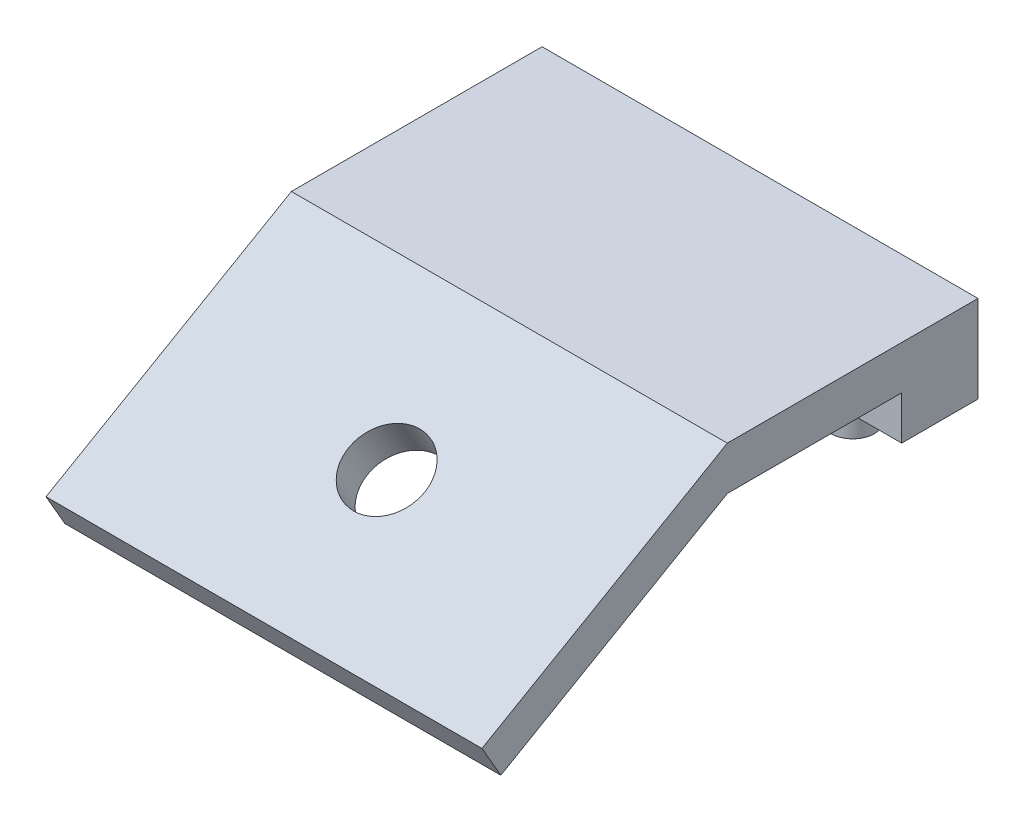
ISO-10303-21;
HEADER;
FILE_DESCRIPTION(('STEP AP214'),'2;1');
FILE_NAME('part.step','',(''),(''),'','','');
FILE_SCHEMA(('AUTOMOTIVE_DESIGN { 1 0 10303 214 1 1 1 1 }'));
ENDSEC;
DATA;
#1=APPLICATION_CONTEXT('core data for automotive mechanical design processes');
#2=APPLICATION_PROTOCOL_DEFINITION('international standard','automotive_design',2000,#1);
#3=PRODUCT_CONTEXT('',#1,'mechanical');
#4=PRODUCT('Part','Part','',(#3));
#5=PRODUCT_RELATED_PRODUCT_CATEGORY('part','',(#4));
#6=PRODUCT_DEFINITION_FORMATION('','',#4);
#7=PRODUCT_DEFINITION_CONTEXT('part definition',#1,'design');
#8=PRODUCT_DEFINITION('design','',#6,#7);
#9=PRODUCT_DEFINITION_SHAPE('','',#8);
#10=(LENGTH_UNIT() NAMED_UNIT(*) SI_UNIT(.MILLI.,.METRE.));
#11=(NAMED_UNIT(*) PLANE_ANGLE_UNIT() SI_UNIT($,.RADIAN.));
#12=(NAMED_UNIT(*) SI_UNIT($,.STERADIAN.) SOLID_ANGLE_UNIT());
#13=UNCERTAINTY_MEASURE_WITH_UNIT(LENGTH_MEASURE(1.E-05),#10,'distance_accuracy_value','');
#14=(GEOMETRIC_REPRESENTATION_CONTEXT(3) GLOBAL_UNCERTAINTY_ASSIGNED_CONTEXT((#13)) GLOBAL_UNIT_ASSIGNED_CONTEXT((#10,
#11,#12)) REPRESENTATION_CONTEXT('',''));
#15=CARTESIAN_POINT('',(0.,0.,0.));
#16=DIRECTION('',(0.,0.,1.));
#17=DIRECTION('',(1.,0.,0.));
#18=AXIS2_PLACEMENT_3D('',#15,#16,#17);
#19=CARTESIAN_POINT('',(-10.,4.,1.75));
#20=DIRECTION('',(0.,0.,-1.));
#21=DIRECTION('',(-1.,0.,0.));
#22=AXIS2_PLACEMENT_3D('',#19,#20,#21);
#23=PLANE('',#22);
#24=DIRECTION('',(1.,0.,0.));
#25=VECTOR('',#24,1.);
#26=CARTESIAN_POINT('',(-10.,2.,1.75));
#27=LINE('',#26,#25);
#28=CARTESIAN_POINT('',(-10.,2.,1.75));
#29=VERTEX_POINT('',#28);
#30=CARTESIAN_POINT('',(10.,2.,1.75));
#31=VERTEX_POINT('',#30);
#32=EDGE_CURVE('E48',#29,#31,#27,.T.);
#33=ORIENTED_EDGE('',*,*,#32,.F.);
#34=DIRECTION('',(0.,-1.,0.));
#35=VECTOR('',#34,1.);
#36=CARTESIAN_POINT('',(-10.,4.,1.75));
#37=LINE('',#36,#35);
#38=CARTESIAN_POINT('',(-10.,0.,1.75));
#39=VERTEX_POINT('',#38);
#40=EDGE_CURVE('E84',#29,#39,#37,.T.);
#41=ORIENTED_EDGE('',*,*,#40,.T.);
#42=DIRECTION('',(1.,0.,0.));
#43=VECTOR('',#42,1.);
#44=CARTESIAN_POINT('',(-10.,0.,1.75));
#45=LINE('',#44,#43);
#46=CARTESIAN_POINT('',(10.,0.,1.75));
#47=VERTEX_POINT('',#46);
#48=EDGE_CURVE('E88',#39,#47,#45,.T.);
#49=ORIENTED_EDGE('',*,*,#48,.T.);
#50=DIRECTION('',(0.,-1.,0.));
#51=VECTOR('',#50,1.);
#52=CARTESIAN_POINT('',(10.,4.,1.75));
#53=LINE('',#52,#51);
#54=EDGE_CURVE('E75',#31,#47,#53,.T.);
#55=ORIENTED_EDGE('',*,*,#54,.F.);
#56=EDGE_LOOP('',(#33,#41,#49,#55));
#57=FACE_BOUND('',#56,.T.);
#58=ADVANCED_FACE('F32',(#57),#23,.F.);
#59=CARTESIAN_POINT('',(10.,4.,1.75));
#60=DIRECTION('',(-1.,0.,0.));
#61=DIRECTION('',(0.,0.,1.));
#62=AXIS2_PLACEMENT_3D('',#59,#60,#61);
#63=PLANE('',#62);
#64=DIRECTION('',(0.,0.,-1.));
#65=VECTOR('',#64,1.);
#66=CARTESIAN_POINT('',(10.,0.,1.75));
#67=LINE('',#66,#65);
#68=CARTESIAN_POINT('',(10.,0.,-1.75));
#69=VERTEX_POINT('',#68);
#70=EDGE_CURVE('E79',#47,#69,#67,.T.);
#71=ORIENTED_EDGE('',*,*,#70,.T.);
#72=DIRECTION('',(0.,-1.,0.));
#73=VECTOR('',#72,1.);
#74=CARTESIAN_POINT('',(10.,4.,-1.75));
#75=LINE('',#74,#73);
#76=CARTESIAN_POINT('',(10.,4.,-1.75));
#77=VERTEX_POINT('',#76);
#78=EDGE_CURVE('E11',#77,#69,#75,.T.);
#79=ORIENTED_EDGE('',*,*,#78,.F.);
#80=DIRECTION('',(0.,0.,-1.));
#81=VECTOR('',#80,1.);
#82=CARTESIAN_POINT('',(10.,4.,1.75));
#83=LINE('',#82,#81);
#84=CARTESIAN_POINT('',(10.,4.,9.75));
#85=VERTEX_POINT('',#84);
#86=EDGE_CURVE('E92',#85,#77,#83,.T.);
#87=ORIENTED_EDGE('',*,*,#86,.F.);
#88=DIRECTION('',(0.,-0.500000000000001,0.866025403784438));
#89=VECTOR('',#88,1.);
#90=CARTESIAN_POINT('',(10.,288684.763759938,-500000.));
#91=LINE('',#90,#89);
#92=CARTESIAN_POINT('',(10.,-2.50000000000001,21.0083302491977));
#93=VERTEX_POINT('',#92);
#94=EDGE_CURVE('E121',#85,#93,#91,.T.);
#95=ORIENTED_EDGE('',*,*,#94,.T.);
#96=DIRECTION('',(0.,0.866025403784438,0.500000000000002));
#97=VECTOR('',#96,1.);
#98=CARTESIAN_POINT('',(10.,-4.00000000000001,20.1423048454133));
#99=LINE('',#98,#97);
#100=CARTESIAN_POINT('',(10.,-4.00000000000001,20.1423048454133));
#101=VERTEX_POINT('',#100);
#102=EDGE_CURVE('E363',#101,#93,#99,.T.);
#103=ORIENTED_EDGE('',*,*,#102,.F.);
#104=DIRECTION('',(0.,0.500000000000001,-0.866025403784438));
#105=VECTOR('',#104,1.);
#106=CARTESIAN_POINT('',(10.,-4.00000000000001,20.1423048454133));
#107=LINE('',#106,#105);
#108=CARTESIAN_POINT('',(10.,2.,9.75));
#109=VERTEX_POINT('',#108);
#110=EDGE_CURVE('E143',#101,#109,#107,.T.);
#111=ORIENTED_EDGE('',*,*,#110,.T.);
#112=DIRECTION('',(0.,0.,-1.));
#113=VECTOR('',#112,1.);
#114=CARTESIAN_POINT('',(10.,2.,9.75));
#115=LINE('',#114,#113);
#116=EDGE_CURVE('E83',#109,#31,#115,.T.);
#117=ORIENTED_EDGE('',*,*,#116,.T.);
#118=ORIENTED_EDGE('',*,*,#54,.T.);
#119=EDGE_LOOP('',(#71,#79,#87,#95,#103,#111,#117,#118));
#120=FACE_BOUND('',#119,.T.);
#121=ADVANCED_FACE('F34',(#120),#63,.F.);
#122=CARTESIAN_POINT('',(-10.,4.,-1.75));
#123=DIRECTION('',(0.,0.,1.));
#124=DIRECTION('',(1.,0.,0.));
#125=AXIS2_PLACEMENT_3D('',#122,#123,#124);
#126=PLANE('',#125);
#127=DIRECTION('',(-1.,0.,0.));
#128=VECTOR('',#127,1.);
#129=CARTESIAN_POINT('',(-10.,0.,-1.75));
#130=LINE('',#129,#128);
#131=CARTESIAN_POINT('',(-10.,0.,-1.75));
#132=VERTEX_POINT('',#131);
#133=EDGE_CURVE('E96',#69,#132,#130,.T.);
#134=ORIENTED_EDGE('',*,*,#133,.T.);
#135=DIRECTION('',(0.,-1.,0.));
#136=VECTOR('',#135,1.);
#137=CARTESIAN_POINT('',(-10.,4.,-1.75));
#138=LINE('',#137,#136);
#139=CARTESIAN_POINT('',(-10.,4.,-1.75));
#140=VERTEX_POINT('',#139);
#141=EDGE_CURVE('E41',#140,#132,#138,.T.);
#142=ORIENTED_EDGE('',*,*,#141,.F.);
#143=DIRECTION('',(-1.,0.,0.));
#144=VECTOR('',#143,1.);
#145=CARTESIAN_POINT('',(-10.,4.,-1.75));
#146=LINE('',#145,#144);
#147=EDGE_CURVE('E57',#77,#140,#146,.T.);
#148=ORIENTED_EDGE('',*,*,#147,.F.);
#149=ORIENTED_EDGE('',*,*,#78,.T.);
#150=EDGE_LOOP('',(#134,#142,#148,#149));
#151=FACE_BOUND('',#150,.T.);
#152=ADVANCED_FACE('F114',(#151),#126,.F.);
#153=CARTESIAN_POINT('',(-10.,4.,1.75));
#154=DIRECTION('',(1.,0.,0.));
#155=DIRECTION('',(0.,0.,-1.));
#156=AXIS2_PLACEMENT_3D('',#153,#154,#155);
#157=PLANE('',#156);
#158=DIRECTION('',(0.,0.,1.));
#159=VECTOR('',#158,1.);
#160=CARTESIAN_POINT('',(-10.,0.,1.75));
#161=LINE('',#160,#159);
#162=EDGE_CURVE('E93',#132,#39,#161,.T.);
#163=ORIENTED_EDGE('',*,*,#162,.T.);
#164=ORIENTED_EDGE('',*,*,#40,.F.);
#165=DIRECTION('',(0.,0.,-1.));
#166=VECTOR('',#165,1.);
#167=CARTESIAN_POINT('',(-10.,2.,9.75));
#168=LINE('',#167,#166);
#169=CARTESIAN_POINT('',(-10.,2.,9.75));
#170=VERTEX_POINT('',#169);
#171=EDGE_CURVE('E151',#170,#29,#168,.T.);
#172=ORIENTED_EDGE('',*,*,#171,.F.);
#173=DIRECTION('',(0.,0.500000000000001,-0.866025403784438));
#174=VECTOR('',#173,1.);
#175=CARTESIAN_POINT('',(-10.,-4.00000000000001,20.1423048454133));
#176=LINE('',#175,#174);
#177=CARTESIAN_POINT('',(-10.,-4.00000000000001,20.1423048454133));
#178=VERTEX_POINT('',#177);
#179=EDGE_CURVE('E139',#178,#170,#176,.T.);
#180=ORIENTED_EDGE('',*,*,#179,.F.);
#181=DIRECTION('',(0.,-0.866025403784438,-0.500000000000002));
#182=VECTOR('',#181,1.);
#183=CARTESIAN_POINT('',(-10.,-4.00000000000001,20.1423048454133));
#184=LINE('',#183,#182);
#185=CARTESIAN_POINT('',(-10.,-2.50000000000001,21.0083302491977));
#186=VERTEX_POINT('',#185);
#187=EDGE_CURVE('E355',#186,#178,#184,.T.);
#188=ORIENTED_EDGE('',*,*,#187,.F.);
#189=DIRECTION('',(0.,-0.500000000000001,0.866025403784438));
#190=VECTOR('',#189,1.);
#191=CARTESIAN_POINT('',(-10.,288684.763759938,-500000.));
#192=LINE('',#191,#190);
#193=CARTESIAN_POINT('',(-10.,4.0000000000191,9.74999999993997));
#194=VERTEX_POINT('',#193);
#195=EDGE_CURVE('E138',#194,#186,#192,.T.);
#196=ORIENTED_EDGE('',*,*,#195,.F.);
#197=DIRECTION('',(0.,0.,1.));
#198=VECTOR('',#197,1.);
#199=CARTESIAN_POINT('',(-10.,4.,1.75));
#200=LINE('',#199,#198);
#201=EDGE_CURVE('E85',#140,#194,#200,.T.);
#202=ORIENTED_EDGE('',*,*,#201,.F.);
#203=ORIENTED_EDGE('',*,*,#141,.T.);
#204=EDGE_LOOP('',(#163,#164,#172,#180,#188,#196,#202,#203));
#205=FACE_BOUND('',#204,.T.);
#206=ADVANCED_FACE('F111',(#205),#157,.F.);
#207=CARTESIAN_POINT('',(0.,4.,0.));
#208=DIRECTION('',(0.,-1.,0.));
#209=DIRECTION('',(0.,0.,-1.));
#210=AXIS2_PLACEMENT_3D('',#207,#208,#209);
#211=PLANE('',#210);
#212=ORIENTED_EDGE('',*,*,#86,.T.);
#213=ORIENTED_EDGE('',*,*,#147,.T.);
#214=ORIENTED_EDGE('',*,*,#201,.T.);
#215=DIRECTION('',(-1.,0.,0.));
#216=VECTOR('',#215,1.);
#217=CARTESIAN_POINT('',(-10.,4.,9.75));
#218=LINE('',#217,#216);
#219=EDGE_CURVE('E127',#85,#194,#218,.T.);
#220=ORIENTED_EDGE('',*,*,#219,.F.);
#221=EDGE_LOOP('',(#212,#213,#214,#220));
#222=FACE_BOUND('',#221,.T.);
#223=ADVANCED_FACE('F128',(#222),#211,.F.);
#224=CARTESIAN_POINT('',(0.,0.,0.));
#225=DIRECTION('',(0.,-1.,0.));
#226=DIRECTION('',(0.,0.,-1.));
#227=AXIS2_PLACEMENT_3D('',#224,#225,#226);
#228=PLANE('',#227);
#229=CARTESIAN_POINT('',(6.00000000000698,0.,0.));
#230=DIRECTION('',(0.,-1.,0.));
#231=DIRECTION('',(0.,0.,1.));
#232=AXIS2_PLACEMENT_3D('',#229,#230,#231);
#233=CIRCLE('',#232,1.);
#234=CARTESIAN_POINT('',(6.00000000000698,0.,1.));
#235=VERTEX_POINT('',#234);
#236=EDGE_CURVE('E154',#235,#235,#233,.T.);
#237=ORIENTED_EDGE('',*,*,#236,.F.);
#238=EDGE_LOOP('',(#237));
#239=FACE_BOUND('',#238,.T.);
#240=CARTESIAN_POINT('',(-5.99999999999302,0.,0.));
#241=DIRECTION('',(0.,-1.,0.));
#242=DIRECTION('',(0.,0.,1.));
#243=AXIS2_PLACEMENT_3D('',#240,#241,#242);
#244=CIRCLE('',#243,1.);
#245=CARTESIAN_POINT('',(-5.99999999999302,0.,1.));
#246=VERTEX_POINT('',#245);
#247=EDGE_CURVE('E158',#246,#246,#244,.T.);
#248=ORIENTED_EDGE('',*,*,#247,.F.);
#249=EDGE_LOOP('',(#248));
#250=FACE_BOUND('',#249,.T.);
#251=CARTESIAN_POINT('',(0.,0.,0.));
#252=DIRECTION('',(0.,-1.,0.));
#253=DIRECTION('',(0.,0.,-1.));
#254=AXIS2_PLACEMENT_3D('',#251,#252,#253);
#255=CIRCLE('',#254,1.);
#256=CARTESIAN_POINT('',(0.,0.,-1.));
#257=VERTEX_POINT('',#256);
#258=EDGE_CURVE('E101',#257,#257,#255,.T.);
#259=ORIENTED_EDGE('',*,*,#258,.F.);
#260=EDGE_LOOP('',(#259));
#261=FACE_BOUND('',#260,.T.);
#262=ORIENTED_EDGE('',*,*,#70,.F.);
#263=ORIENTED_EDGE('',*,*,#48,.F.);
#264=ORIENTED_EDGE('',*,*,#162,.F.);
#265=ORIENTED_EDGE('',*,*,#133,.F.);
#266=EDGE_LOOP('',(#262,#263,#264,#265));
#267=FACE_BOUND('',#266,.T.);
#268=ADVANCED_FACE('F95',(#239,#250,#261,#267),#228,.T.);
#269=CARTESIAN_POINT('',(0.,-2.,0.));
#270=DIRECTION('',(0.,1.,0.));
#271=DIRECTION('',(0.,0.,1.));
#272=AXIS2_PLACEMENT_3D('',#269,#270,#271);
#273=CYLINDRICAL_SURFACE('',#272,1.);
#274=CARTESIAN_POINT('',(0.,-2.,0.));
#275=DIRECTION('',(0.,-1.,0.));
#276=DIRECTION('',(0.,0.,-1.));
#277=AXIS2_PLACEMENT_3D('',#274,#275,#276);
#278=CIRCLE('',#277,1.);
#279=CARTESIAN_POINT('',(0.,-2.,-1.));
#280=VERTEX_POINT('',#279);
#281=EDGE_CURVE('E97',#280,#280,#278,.T.);
#282=ORIENTED_EDGE('',*,*,#281,.F.);
#283=EDGE_LOOP('',(#282));
#284=FACE_BOUND('',#283,.T.);
#285=ORIENTED_EDGE('',*,*,#258,.T.);
#286=EDGE_LOOP('',(#285));
#287=FACE_BOUND('',#286,.T.);
#288=ADVANCED_FACE('F169',(#284,#287),#273,.T.);
#289=CARTESIAN_POINT('',(0.,-2.,0.));
#290=DIRECTION('',(0.,-1.,0.));
#291=DIRECTION('',(0.,0.,-1.));
#292=AXIS2_PLACEMENT_3D('',#289,#290,#291);
#293=PLANE('',#292);
#294=ORIENTED_EDGE('',*,*,#281,.T.);
#295=EDGE_LOOP('',(#294));
#296=FACE_BOUND('',#295,.T.);
#297=ADVANCED_FACE('F178',(#296),#293,.T.);
#298=CARTESIAN_POINT('',(-5.99999999999302,-2.,0.));
#299=DIRECTION('',(0.,1.,0.));
#300=DIRECTION('',(0.,0.,1.));
#301=AXIS2_PLACEMENT_3D('',#298,#299,#300);
#302=CYLINDRICAL_SURFACE('',#301,1.);
#303=CARTESIAN_POINT('',(-5.99999999999302,-2.,0.));
#304=DIRECTION('',(0.,-1.,0.));
#305=DIRECTION('',(0.,0.,1.));
#306=AXIS2_PLACEMENT_3D('',#303,#304,#305);
#307=CIRCLE('',#306,1.);
#308=CARTESIAN_POINT('',(-5.99999999999302,-2.,1.));
#309=VERTEX_POINT('',#308);
#310=EDGE_CURVE('E161',#309,#309,#307,.T.);
#311=ORIENTED_EDGE('',*,*,#310,.F.);
#312=EDGE_LOOP('',(#311));
#313=FACE_BOUND('',#312,.T.);
#314=ORIENTED_EDGE('',*,*,#247,.T.);
#315=EDGE_LOOP('',(#314));
#316=FACE_BOUND('',#315,.T.);
#317=ADVANCED_FACE('F274',(#313,#316),#302,.T.);
#318=CARTESIAN_POINT('',(-5.99999999999302,-2.,0.));
#319=DIRECTION('',(0.,1.,0.));
#320=DIRECTION('',(0.,0.,1.));
#321=AXIS2_PLACEMENT_3D('',#318,#319,#320);
#322=PLANE('',#321);
#323=ORIENTED_EDGE('',*,*,#310,.T.);
#324=EDGE_LOOP('',(#323));
#325=FACE_BOUND('',#324,.T.);
#326=ADVANCED_FACE('F270',(#325),#322,.F.);
#327=CARTESIAN_POINT('',(6.00000000000698,-2.,0.));
#328=DIRECTION('',(0.,1.,0.));
#329=DIRECTION('',(0.,0.,1.));
#330=AXIS2_PLACEMENT_3D('',#327,#328,#329);
#331=CYLINDRICAL_SURFACE('',#330,1.);
#332=CARTESIAN_POINT('',(6.00000000000698,-2.,0.));
#333=DIRECTION('',(0.,-1.,0.));
#334=DIRECTION('',(0.,0.,1.));
#335=AXIS2_PLACEMENT_3D('',#332,#333,#334);
#336=CIRCLE('',#335,1.);
#337=CARTESIAN_POINT('',(6.00000000000698,-2.,1.));
#338=VERTEX_POINT('',#337);
#339=EDGE_CURVE('E155',#338,#338,#336,.T.);
#340=ORIENTED_EDGE('',*,*,#339,.F.);
#341=EDGE_LOOP('',(#340));
#342=FACE_BOUND('',#341,.T.);
#343=ORIENTED_EDGE('',*,*,#236,.T.);
#344=EDGE_LOOP('',(#343));
#345=FACE_BOUND('',#344,.T.);
#346=ADVANCED_FACE('F266',(#342,#345),#331,.T.);
#347=CARTESIAN_POINT('',(6.00000000000698,-2.,0.));
#348=DIRECTION('',(0.,1.,0.));
#349=DIRECTION('',(0.,0.,1.));
#350=AXIS2_PLACEMENT_3D('',#347,#348,#349);
#351=PLANE('',#350);
#352=ORIENTED_EDGE('',*,*,#339,.T.);
#353=EDGE_LOOP('',(#352));
#354=FACE_BOUND('',#353,.T.);
#355=ADVANCED_FACE('F216',(#354),#351,.F.);
#356=CARTESIAN_POINT('',(-10.,2.,9.75));
#357=DIRECTION('',(0.,1.,0.));
#358=DIRECTION('',(0.,0.,1.));
#359=AXIS2_PLACEMENT_3D('',#356,#357,#358);
#360=PLANE('',#359);
#361=ORIENTED_EDGE('',*,*,#32,.T.);
#362=ORIENTED_EDGE('',*,*,#116,.F.);
#363=DIRECTION('',(1.,0.,0.));
#364=VECTOR('',#363,1.);
#365=CARTESIAN_POINT('',(-10.,2.,9.75));
#366=LINE('',#365,#364);
#367=EDGE_CURVE('E132',#170,#109,#366,.T.);
#368=ORIENTED_EDGE('',*,*,#367,.F.);
#369=ORIENTED_EDGE('',*,*,#171,.T.);
#370=EDGE_LOOP('',(#361,#362,#368,#369));
#371=FACE_BOUND('',#370,.T.);
#372=ADVANCED_FACE('F212',(#371),#360,.F.);
#373=CARTESIAN_POINT('',(-10.,288684.763759938,-500000.));
#374=DIRECTION('',(0.,0.866025403784438,0.500000000000001));
#375=DIRECTION('',(0.,-0.500000000000001,0.866025403784438));
#376=AXIS2_PLACEMENT_3D('',#373,#374,#375);
#377=PLANE('',#376);
#378=CARTESIAN_POINT('',(0.,0.749999999985545,15.3791651245905));
#379=DIRECTION('',(0.,0.866025403784438,0.500000000000001));
#380=DIRECTION('',(0.,-0.500000000000001,0.866025403784438));
#381=AXIS2_PLACEMENT_3D('',#378,#379,#380);
#382=CIRCLE('',#381,1.75);
#383=CARTESIAN_POINT('',(0.,-0.125000000014456,16.8947095812133));
#384=VERTEX_POINT('',#383);
#385=EDGE_CURVE('E352',#384,#384,#382,.T.);
#386=ORIENTED_EDGE('',*,*,#385,.F.);
#387=EDGE_LOOP('',(#386));
#388=FACE_BOUND('',#387,.T.);
#389=ORIENTED_EDGE('',*,*,#219,.T.);
#390=ORIENTED_EDGE('',*,*,#195,.T.);
#391=DIRECTION('',(-1.,0.,0.));
#392=VECTOR('',#391,1.);
#393=CARTESIAN_POINT('',(-10.,-2.50000000000001,21.0083302491977));
#394=LINE('',#393,#392);
#395=EDGE_CURVE('E137',#93,#186,#394,.T.);
#396=ORIENTED_EDGE('',*,*,#395,.F.);
#397=ORIENTED_EDGE('',*,*,#94,.F.);
#398=EDGE_LOOP('',(#389,#390,#396,#397));
#399=FACE_BOUND('',#398,.T.);
#400=ADVANCED_FACE('F135',(#388,#399),#377,.T.);
#401=CARTESIAN_POINT('',(-10.,-4.00000000000001,20.1423048454133));
#402=DIRECTION('',(0.,0.866025403784438,0.500000000000001));
#403=DIRECTION('',(0.,-0.500000000000001,0.866025403784438));
#404=AXIS2_PLACEMENT_3D('',#401,#402,#403);
#405=PLANE('',#404);
#406=CARTESIAN_POINT('',(0.,-0.750000000000008,14.5131397208144));
#407=DIRECTION('',(0.,0.866025403784438,0.500000000000001));
#408=DIRECTION('',(0.,-0.500000000000001,0.866025403784438));
#409=AXIS2_PLACEMENT_3D('',#406,#407,#408);
#410=CIRCLE('',#409,1.75);
#411=CARTESIAN_POINT('',(0.,-1.62500000000001,16.0286841774372));
#412=VERTEX_POINT('',#411);
#413=EDGE_CURVE('E36',#412,#412,#410,.T.);
#414=ORIENTED_EDGE('',*,*,#413,.T.);
#415=EDGE_LOOP('',(#414));
#416=FACE_BOUND('',#415,.T.);
#417=ORIENTED_EDGE('',*,*,#367,.T.);
#418=ORIENTED_EDGE('',*,*,#110,.F.);
#419=DIRECTION('',(1.,0.,0.));
#420=VECTOR('',#419,1.);
#421=CARTESIAN_POINT('',(-10.,-4.00000000000001,20.1423048454133));
#422=LINE('',#421,#420);
#423=EDGE_CURVE('E357',#178,#101,#422,.T.);
#424=ORIENTED_EDGE('',*,*,#423,.F.);
#425=ORIENTED_EDGE('',*,*,#179,.T.);
#426=EDGE_LOOP('',(#417,#418,#424,#425));
#427=FACE_BOUND('',#426,.T.);
#428=ADVANCED_FACE('F231',(#416,#427),#405,.F.);
#429=CARTESIAN_POINT('',(0.,-9.72187384344916,16.8387794416288));
#430=DIRECTION('',(0.,0.500000000000002,-0.866025403784438));
#431=DIRECTION('',(0.,0.866025403784438,0.500000000000002));
#432=AXIS2_PLACEMENT_3D('',#429,#430,#431);
#433=PLANE('',#432);
#434=ORIENTED_EDGE('',*,*,#187,.T.);
#435=ORIENTED_EDGE('',*,*,#423,.T.);
#436=ORIENTED_EDGE('',*,*,#102,.T.);
#437=ORIENTED_EDGE('',*,*,#395,.T.);
#438=EDGE_LOOP('',(#434,#435,#436,#437));
#439=FACE_BOUND('',#438,.T.);
#440=ADVANCED_FACE('F225',(#439),#433,.F.);
#441=CARTESIAN_POINT('',(0.,-10.2296460717605,9.04006350946107));
#442=DIRECTION('',(0.,0.866025403784438,0.500000000000001));
#443=DIRECTION('',(0.,-0.500000000000001,0.866025403784438));
#444=AXIS2_PLACEMENT_3D('',#441,#442,#443);
#445=CYLINDRICAL_SURFACE('',#444,1.75);
#446=ORIENTED_EDGE('',*,*,#385,.T.);
#447=EDGE_LOOP('',(#446));
#448=FACE_BOUND('',#447,.T.);
#449=ORIENTED_EDGE('',*,*,#413,.F.);
#450=EDGE_LOOP('',(#449));
#451=FACE_BOUND('',#450,.T.);
#452=ADVANCED_FACE('F230',(#448,#451),#445,.F.);
#453=CLOSED_SHELL('',(#58,#121,#152,#206,#223,#268,#288,#297,#317,#326,#346,#355,#372,#400,#428,
#440,#452));
#454=MANIFOLD_SOLID_BREP('B2',#453);
#455=ADVANCED_BREP_SHAPE_REPRESENTATION('',(#18,#454),#14);
#456=SHAPE_DEFINITION_REPRESENTATION(#9,#455);
ENDSEC;
END-ISO-10303-21;
